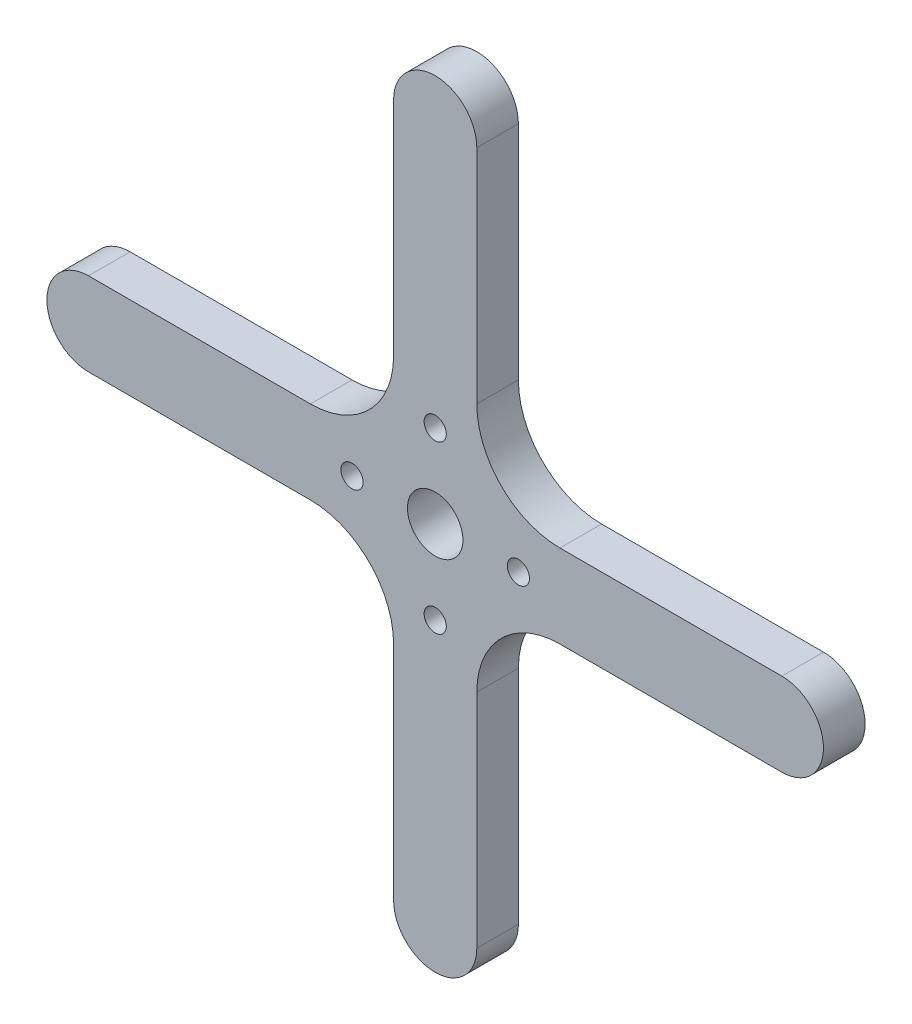
ISO-10303-21;
HEADER;
FILE_DESCRIPTION(('STEP AP214'),'2;1');
FILE_NAME('part.step','',(''),(''),'','','');
FILE_SCHEMA(('AUTOMOTIVE_DESIGN { 1 0 10303 214 1 1 1 1 }'));
ENDSEC;
DATA;
#1=APPLICATION_CONTEXT('core data for automotive mechanical design processes');
#2=APPLICATION_PROTOCOL_DEFINITION('international standard','automotive_design',2000,#1);
#3=PRODUCT_CONTEXT('',#1,'mechanical');
#4=PRODUCT('Part','Part','',(#3));
#5=PRODUCT_RELATED_PRODUCT_CATEGORY('part','',(#4));
#6=PRODUCT_DEFINITION_FORMATION('','',#4);
#7=PRODUCT_DEFINITION_CONTEXT('part definition',#1,'design');
#8=PRODUCT_DEFINITION('design','',#6,#7);
#9=PRODUCT_DEFINITION_SHAPE('','',#8);
#10=(LENGTH_UNIT() NAMED_UNIT(*) SI_UNIT(.MILLI.,.METRE.));
#11=(NAMED_UNIT(*) PLANE_ANGLE_UNIT() SI_UNIT($,.RADIAN.));
#12=(NAMED_UNIT(*) SI_UNIT($,.STERADIAN.) SOLID_ANGLE_UNIT());
#13=UNCERTAINTY_MEASURE_WITH_UNIT(LENGTH_MEASURE(1.E-05),#10,'distance_accuracy_value','');
#14=(GEOMETRIC_REPRESENTATION_CONTEXT(3) GLOBAL_UNCERTAINTY_ASSIGNED_CONTEXT((#13)) GLOBAL_UNIT_ASSIGNED_CONTEXT((#10,
#11,#12)) REPRESENTATION_CONTEXT('',''));
#15=CARTESIAN_POINT('',(0.,0.,0.));
#16=DIRECTION('',(0.,0.,1.));
#17=DIRECTION('',(1.,0.,0.));
#18=AXIS2_PLACEMENT_3D('',#15,#16,#17);
#19=CARTESIAN_POINT('',(0.,3.,3.));
#20=DIRECTION('',(0.,-1.,0.));
#21=DIRECTION('',(1.,0.,0.));
#22=AXIS2_PLACEMENT_3D('',#19,#20,#21);
#23=PLANE('',#22);
#24=DIRECTION('',(-1.,0.,0.));
#25=VECTOR('',#24,1.);
#26=CARTESIAN_POINT('',(0.,3.,0.));
#27=LINE('',#26,#25);
#28=CARTESIAN_POINT('',(25.,3.00000000000001,0.));
#29=VERTEX_POINT('',#28);
#30=CARTESIAN_POINT('',(8.99999999999999,3.00000000000001,0.));
#31=VERTEX_POINT('',#30);
#32=EDGE_CURVE('E241',#29,#31,#27,.T.);
#33=ORIENTED_EDGE('',*,*,#32,.T.);
#34=DIRECTION('',(0.,0.,-1.));
#35=VECTOR('',#34,1.);
#36=CARTESIAN_POINT('',(8.99999999999999,3.00000000000001,3.));
#37=LINE('',#36,#35);
#38=CARTESIAN_POINT('',(8.99999999999999,3.00000000000001,3.));
#39=VERTEX_POINT('',#38);
#40=EDGE_CURVE('E63',#31,#39,#37,.F.);
#41=ORIENTED_EDGE('',*,*,#40,.T.);
#42=DIRECTION('',(-1.,0.,0.));
#43=VECTOR('',#42,1.);
#44=CARTESIAN_POINT('',(0.,3.,3.));
#45=LINE('',#44,#43);
#46=CARTESIAN_POINT('',(25.,3.00000000000001,3.));
#47=VERTEX_POINT('',#46);
#48=EDGE_CURVE('E174',#47,#39,#45,.T.);
#49=ORIENTED_EDGE('',*,*,#48,.F.);
#50=DIRECTION('',(0.,0.,-1.));
#51=VECTOR('',#50,1.);
#52=CARTESIAN_POINT('',(25.,3.00000000000001,3.));
#53=LINE('',#52,#51);
#54=EDGE_CURVE('E240',#47,#29,#53,.T.);
#55=ORIENTED_EDGE('',*,*,#54,.T.);
#56=EDGE_LOOP('',(#33,#41,#49,#55));
#57=FACE_BOUND('',#56,.T.);
#58=ADVANCED_FACE('F47',(#57),#23,.F.);
#59=CARTESIAN_POINT('',(2.99999999999999,0.,3.));
#60=DIRECTION('',(-1.,0.,0.));
#61=DIRECTION('',(0.,-1.,0.));
#62=AXIS2_PLACEMENT_3D('',#59,#60,#61);
#63=PLANE('',#62);
#64=DIRECTION('',(0.,1.,0.));
#65=VECTOR('',#64,1.);
#66=CARTESIAN_POINT('',(2.99999999999999,0.,3.));
#67=LINE('',#66,#65);
#68=CARTESIAN_POINT('',(2.99999999999999,9.00000000000001,3.));
#69=VERTEX_POINT('',#68);
#70=CARTESIAN_POINT('',(2.99999999999999,25.,3.));
#71=VERTEX_POINT('',#70);
#72=EDGE_CURVE('E161',#69,#71,#67,.T.);
#73=ORIENTED_EDGE('',*,*,#72,.F.);
#74=DIRECTION('',(0.,0.,-1.));
#75=VECTOR('',#74,1.);
#76=CARTESIAN_POINT('',(2.99999999999999,9.00000000000001,0.));
#77=LINE('',#76,#75);
#78=CARTESIAN_POINT('',(2.99999999999999,9.00000000000001,0.));
#79=VERTEX_POINT('',#78);
#80=EDGE_CURVE('E340',#69,#79,#77,.T.);
#81=ORIENTED_EDGE('',*,*,#80,.T.);
#82=DIRECTION('',(0.,1.,0.));
#83=VECTOR('',#82,1.);
#84=CARTESIAN_POINT('',(2.99999999999999,0.,0.));
#85=LINE('',#84,#83);
#86=CARTESIAN_POINT('',(2.99999999999999,25.,0.));
#87=VERTEX_POINT('',#86);
#88=EDGE_CURVE('E179',#79,#87,#85,.T.);
#89=ORIENTED_EDGE('',*,*,#88,.T.);
#90=DIRECTION('',(0.,0.,-1.));
#91=VECTOR('',#90,1.);
#92=CARTESIAN_POINT('',(2.99999999999999,25.,3.));
#93=LINE('',#92,#91);
#94=EDGE_CURVE('E177',#71,#87,#93,.T.);
#95=ORIENTED_EDGE('',*,*,#94,.F.);
#96=EDGE_LOOP('',(#73,#81,#89,#95));
#97=FACE_BOUND('',#96,.T.);
#98=ADVANCED_FACE('F178',(#97),#63,.F.);
#99=CARTESIAN_POINT('',(0.,25.,3.));
#100=DIRECTION('',(0.,0.,-1.));
#101=DIRECTION('',(-1.,0.,0.));
#102=AXIS2_PLACEMENT_3D('',#99,#100,#101);
#103=CYLINDRICAL_SURFACE('',#102,3.);
#104=CARTESIAN_POINT('',(0.,25.,0.));
#105=DIRECTION('',(0.,0.,1.));
#106=DIRECTION('',(1.,0.,0.));
#107=AXIS2_PLACEMENT_3D('',#104,#105,#106);
#108=CIRCLE('',#107,3.);
#109=CARTESIAN_POINT('',(-3.00000000000001,25.,0.));
#110=VERTEX_POINT('',#109);
#111=EDGE_CURVE('E247',#87,#110,#108,.T.);
#112=ORIENTED_EDGE('',*,*,#111,.T.);
#113=DIRECTION('',(0.,0.,-1.));
#114=VECTOR('',#113,1.);
#115=CARTESIAN_POINT('',(-3.00000000000001,25.,3.));
#116=LINE('',#115,#114);
#117=CARTESIAN_POINT('',(-3.00000000000001,25.,3.));
#118=VERTEX_POINT('',#117);
#119=EDGE_CURVE('E185',#118,#110,#116,.T.);
#120=ORIENTED_EDGE('',*,*,#119,.F.);
#121=CARTESIAN_POINT('',(0.,25.,3.));
#122=DIRECTION('',(0.,0.,1.));
#123=DIRECTION('',(1.,0.,0.));
#124=AXIS2_PLACEMENT_3D('',#121,#122,#123);
#125=CIRCLE('',#124,3.);
#126=EDGE_CURVE('E167',#71,#118,#125,.T.);
#127=ORIENTED_EDGE('',*,*,#126,.F.);
#128=ORIENTED_EDGE('',*,*,#94,.T.);
#129=EDGE_LOOP('',(#112,#120,#127,#128));
#130=FACE_BOUND('',#129,.T.);
#131=ADVANCED_FACE('F187',(#130),#103,.T.);
#132=CARTESIAN_POINT('',(-3.00000000000001,0.,3.));
#133=DIRECTION('',(-1.,0.,0.));
#134=DIRECTION('',(0.,-1.,0.));
#135=AXIS2_PLACEMENT_3D('',#132,#133,#134);
#136=PLANE('',#135);
#137=DIRECTION('',(0.,1.,0.));
#138=VECTOR('',#137,1.);
#139=CARTESIAN_POINT('',(-3.00000000000001,0.,0.));
#140=LINE('',#139,#138);
#141=CARTESIAN_POINT('',(-3.00000000000001,9.,0.));
#142=VERTEX_POINT('',#141);
#143=EDGE_CURVE('E250',#142,#110,#140,.T.);
#144=ORIENTED_EDGE('',*,*,#143,.F.);
#145=DIRECTION('',(0.,0.,-1.));
#146=VECTOR('',#145,1.);
#147=CARTESIAN_POINT('',(-3.00000000000001,9.,3.));
#148=LINE('',#147,#146);
#149=CARTESIAN_POINT('',(-3.00000000000001,9.,3.));
#150=VERTEX_POINT('',#149);
#151=EDGE_CURVE('E323',#142,#150,#148,.F.);
#152=ORIENTED_EDGE('',*,*,#151,.T.);
#153=DIRECTION('',(0.,1.,0.));
#154=VECTOR('',#153,1.);
#155=CARTESIAN_POINT('',(-3.00000000000001,0.,3.));
#156=LINE('',#155,#154);
#157=EDGE_CURVE('E190',#150,#118,#156,.T.);
#158=ORIENTED_EDGE('',*,*,#157,.T.);
#159=ORIENTED_EDGE('',*,*,#119,.T.);
#160=EDGE_LOOP('',(#144,#152,#158,#159));
#161=FACE_BOUND('',#160,.T.);
#162=ADVANCED_FACE('F415',(#161),#136,.T.);
#163=CARTESIAN_POINT('',(0.,3.,3.));
#164=DIRECTION('',(0.,-1.,0.));
#165=DIRECTION('',(1.,0.,0.));
#166=AXIS2_PLACEMENT_3D('',#163,#164,#165);
#167=PLANE('',#166);
#168=DIRECTION('',(-1.,0.,0.));
#169=VECTOR('',#168,1.);
#170=CARTESIAN_POINT('',(0.,3.,3.));
#171=LINE('',#170,#169);
#172=CARTESIAN_POINT('',(-9.00000000000001,3.,3.));
#173=VERTEX_POINT('',#172);
#174=CARTESIAN_POINT('',(-25.,3.,3.));
#175=VERTEX_POINT('',#174);
#176=EDGE_CURVE('E193',#173,#175,#171,.T.);
#177=ORIENTED_EDGE('',*,*,#176,.F.);
#178=DIRECTION('',(0.,0.,-1.));
#179=VECTOR('',#178,1.);
#180=CARTESIAN_POINT('',(-9.00000000000001,3.,3.));
#181=LINE('',#180,#179);
#182=CARTESIAN_POINT('',(-9.00000000000001,3.,0.));
#183=VERTEX_POINT('',#182);
#184=EDGE_CURVE('E184',#173,#183,#181,.T.);
#185=ORIENTED_EDGE('',*,*,#184,.T.);
#186=DIRECTION('',(-1.,0.,0.));
#187=VECTOR('',#186,1.);
#188=CARTESIAN_POINT('',(0.,3.,0.));
#189=LINE('',#188,#187);
#190=CARTESIAN_POINT('',(-25.,3.,0.));
#191=VERTEX_POINT('',#190);
#192=EDGE_CURVE('E253',#183,#191,#189,.T.);
#193=ORIENTED_EDGE('',*,*,#192,.T.);
#194=DIRECTION('',(0.,0.,-1.));
#195=VECTOR('',#194,1.);
#196=CARTESIAN_POINT('',(-25.,3.,3.));
#197=LINE('',#196,#195);
#198=EDGE_CURVE('E314',#175,#191,#197,.T.);
#199=ORIENTED_EDGE('',*,*,#198,.F.);
#200=EDGE_LOOP('',(#177,#185,#193,#199));
#201=FACE_BOUND('',#200,.T.);
#202=ADVANCED_FACE('F408',(#201),#167,.F.);
#203=CARTESIAN_POINT('',(-25.,0.,3.));
#204=DIRECTION('',(0.,0.,-1.));
#205=DIRECTION('',(-1.,0.,0.));
#206=AXIS2_PLACEMENT_3D('',#203,#204,#205);
#207=CYLINDRICAL_SURFACE('',#206,3.);
#208=CARTESIAN_POINT('',(-25.,0.,0.));
#209=DIRECTION('',(0.,0.,1.));
#210=DIRECTION('',(1.,0.,0.));
#211=AXIS2_PLACEMENT_3D('',#208,#209,#210);
#212=CIRCLE('',#211,3.);
#213=CARTESIAN_POINT('',(-25.,-3.,0.));
#214=VERTEX_POINT('',#213);
#215=EDGE_CURVE('E256',#191,#214,#212,.T.);
#216=ORIENTED_EDGE('',*,*,#215,.T.);
#217=DIRECTION('',(0.,0.,-1.));
#218=VECTOR('',#217,1.);
#219=CARTESIAN_POINT('',(-25.,-3.,3.));
#220=LINE('',#219,#218);
#221=CARTESIAN_POINT('',(-25.,-3.,3.));
#222=VERTEX_POINT('',#221);
#223=EDGE_CURVE('E310',#222,#214,#220,.T.);
#224=ORIENTED_EDGE('',*,*,#223,.F.);
#225=CARTESIAN_POINT('',(-25.,0.,3.));
#226=DIRECTION('',(0.,0.,1.));
#227=DIRECTION('',(1.,0.,0.));
#228=AXIS2_PLACEMENT_3D('',#225,#226,#227);
#229=CIRCLE('',#228,3.);
#230=EDGE_CURVE('E199',#175,#222,#229,.T.);
#231=ORIENTED_EDGE('',*,*,#230,.F.);
#232=ORIENTED_EDGE('',*,*,#198,.T.);
#233=EDGE_LOOP('',(#216,#224,#231,#232));
#234=FACE_BOUND('',#233,.T.);
#235=ADVANCED_FACE('F402',(#234),#207,.T.);
#236=CARTESIAN_POINT('',(0.,-3.,3.));
#237=DIRECTION('',(0.,-1.,0.));
#238=DIRECTION('',(1.,0.,0.));
#239=AXIS2_PLACEMENT_3D('',#236,#237,#238);
#240=PLANE('',#239);
#241=DIRECTION('',(-1.,0.,0.));
#242=VECTOR('',#241,1.);
#243=CARTESIAN_POINT('',(0.,-3.,0.));
#244=LINE('',#243,#242);
#245=CARTESIAN_POINT('',(-9.00000000000001,-3.,0.));
#246=VERTEX_POINT('',#245);
#247=EDGE_CURVE('E260',#246,#214,#244,.T.);
#248=ORIENTED_EDGE('',*,*,#247,.F.);
#249=DIRECTION('',(0.,0.,-1.));
#250=VECTOR('',#249,1.);
#251=CARTESIAN_POINT('',(-9.00000000000001,-3.,3.));
#252=LINE('',#251,#250);
#253=CARTESIAN_POINT('',(-9.00000000000001,-3.,3.));
#254=VERTEX_POINT('',#253);
#255=EDGE_CURVE('E330',#246,#254,#252,.F.);
#256=ORIENTED_EDGE('',*,*,#255,.T.);
#257=DIRECTION('',(-1.,0.,0.));
#258=VECTOR('',#257,1.);
#259=CARTESIAN_POINT('',(0.,-3.,3.));
#260=LINE('',#259,#258);
#261=EDGE_CURVE('E203',#254,#222,#260,.T.);
#262=ORIENTED_EDGE('',*,*,#261,.T.);
#263=ORIENTED_EDGE('',*,*,#223,.T.);
#264=EDGE_LOOP('',(#248,#256,#262,#263));
#265=FACE_BOUND('',#264,.T.);
#266=ADVANCED_FACE('F397',(#265),#240,.T.);
#267=CARTESIAN_POINT('',(-3.00000000000001,0.,3.));
#268=DIRECTION('',(-1.,0.,0.));
#269=DIRECTION('',(0.,-1.,0.));
#270=AXIS2_PLACEMENT_3D('',#267,#268,#269);
#271=PLANE('',#270);
#272=DIRECTION('',(0.,1.,0.));
#273=VECTOR('',#272,1.);
#274=CARTESIAN_POINT('',(-3.00000000000001,0.,3.));
#275=LINE('',#274,#273);
#276=CARTESIAN_POINT('',(-3.00000000000001,-25.,3.));
#277=VERTEX_POINT('',#276);
#278=CARTESIAN_POINT('',(-3.00000000000001,-9.,3.));
#279=VERTEX_POINT('',#278);
#280=EDGE_CURVE('E206',#277,#279,#275,.T.);
#281=ORIENTED_EDGE('',*,*,#280,.T.);
#282=DIRECTION('',(0.,0.,-1.));
#283=VECTOR('',#282,1.);
#284=CARTESIAN_POINT('',(-3.00000000000001,-9.,0.));
#285=LINE('',#284,#283);
#286=CARTESIAN_POINT('',(-3.00000000000001,-9.,0.));
#287=VERTEX_POINT('',#286);
#288=EDGE_CURVE('E326',#279,#287,#285,.T.);
#289=ORIENTED_EDGE('',*,*,#288,.T.);
#290=DIRECTION('',(0.,1.,0.));
#291=VECTOR('',#290,1.);
#292=CARTESIAN_POINT('',(-3.00000000000001,0.,0.));
#293=LINE('',#292,#291);
#294=CARTESIAN_POINT('',(-3.00000000000001,-25.,0.));
#295=VERTEX_POINT('',#294);
#296=EDGE_CURVE('E263',#295,#287,#293,.T.);
#297=ORIENTED_EDGE('',*,*,#296,.F.);
#298=DIRECTION('',(0.,0.,-1.));
#299=VECTOR('',#298,1.);
#300=CARTESIAN_POINT('',(-3.00000000000001,-25.,3.));
#301=LINE('',#300,#299);
#302=EDGE_CURVE('E307',#277,#295,#301,.T.);
#303=ORIENTED_EDGE('',*,*,#302,.F.);
#304=EDGE_LOOP('',(#281,#289,#297,#303));
#305=FACE_BOUND('',#304,.T.);
#306=ADVANCED_FACE('F388',(#305),#271,.T.);
#307=CARTESIAN_POINT('',(0.,-25.,3.));
#308=DIRECTION('',(0.,0.,-1.));
#309=DIRECTION('',(-1.,0.,0.));
#310=AXIS2_PLACEMENT_3D('',#307,#308,#309);
#311=CYLINDRICAL_SURFACE('',#310,3.);
#312=CARTESIAN_POINT('',(0.,-25.,0.));
#313=DIRECTION('',(0.,0.,1.));
#314=DIRECTION('',(1.,0.,0.));
#315=AXIS2_PLACEMENT_3D('',#312,#313,#314);
#316=CIRCLE('',#315,3.);
#317=CARTESIAN_POINT('',(2.99999999999999,-25.,0.));
#318=VERTEX_POINT('',#317);
#319=EDGE_CURVE('E267',#295,#318,#316,.T.);
#320=ORIENTED_EDGE('',*,*,#319,.T.);
#321=DIRECTION('',(0.,0.,-1.));
#322=VECTOR('',#321,1.);
#323=CARTESIAN_POINT('',(2.99999999999999,-25.,3.));
#324=LINE('',#323,#322);
#325=CARTESIAN_POINT('',(2.99999999999999,-25.,3.));
#326=VERTEX_POINT('',#325);
#327=EDGE_CURVE('E303',#326,#318,#324,.T.);
#328=ORIENTED_EDGE('',*,*,#327,.F.);
#329=CARTESIAN_POINT('',(0.,-25.,3.));
#330=DIRECTION('',(0.,0.,1.));
#331=DIRECTION('',(1.,0.,0.));
#332=AXIS2_PLACEMENT_3D('',#329,#330,#331);
#333=CIRCLE('',#332,3.);
#334=EDGE_CURVE('E210',#277,#326,#333,.T.);
#335=ORIENTED_EDGE('',*,*,#334,.F.);
#336=ORIENTED_EDGE('',*,*,#302,.T.);
#337=EDGE_LOOP('',(#320,#328,#335,#336));
#338=FACE_BOUND('',#337,.T.);
#339=ADVANCED_FACE('F384',(#338),#311,.T.);
#340=CARTESIAN_POINT('',(2.99999999999999,0.,3.));
#341=DIRECTION('',(-1.,0.,0.));
#342=DIRECTION('',(0.,-1.,0.));
#343=AXIS2_PLACEMENT_3D('',#340,#341,#342);
#344=PLANE('',#343);
#345=DIRECTION('',(0.,1.,0.));
#346=VECTOR('',#345,1.);
#347=CARTESIAN_POINT('',(2.99999999999999,0.,0.));
#348=LINE('',#347,#346);
#349=CARTESIAN_POINT('',(2.99999999999999,-8.99999999999999,0.));
#350=VERTEX_POINT('',#349);
#351=EDGE_CURVE('E270',#318,#350,#348,.T.);
#352=ORIENTED_EDGE('',*,*,#351,.T.);
#353=DIRECTION('',(0.,0.,-1.));
#354=VECTOR('',#353,1.);
#355=CARTESIAN_POINT('',(2.99999999999999,-8.99999999999999,3.));
#356=LINE('',#355,#354);
#357=CARTESIAN_POINT('',(2.99999999999999,-8.99999999999999,3.));
#358=VERTEX_POINT('',#357);
#359=EDGE_CURVE('E337',#350,#358,#356,.F.);
#360=ORIENTED_EDGE('',*,*,#359,.T.);
#361=DIRECTION('',(0.,1.,0.));
#362=VECTOR('',#361,1.);
#363=CARTESIAN_POINT('',(2.99999999999999,0.,3.));
#364=LINE('',#363,#362);
#365=EDGE_CURVE('E213',#326,#358,#364,.T.);
#366=ORIENTED_EDGE('',*,*,#365,.F.);
#367=ORIENTED_EDGE('',*,*,#327,.T.);
#368=EDGE_LOOP('',(#352,#360,#366,#367));
#369=FACE_BOUND('',#368,.T.);
#370=ADVANCED_FACE('F380',(#369),#344,.F.);
#371=CARTESIAN_POINT('',(0.,-3.,3.));
#372=DIRECTION('',(0.,-1.,0.));
#373=DIRECTION('',(1.,0.,0.));
#374=AXIS2_PLACEMENT_3D('',#371,#372,#373);
#375=PLANE('',#374);
#376=DIRECTION('',(-1.,0.,0.));
#377=VECTOR('',#376,1.);
#378=CARTESIAN_POINT('',(0.,-3.,3.));
#379=LINE('',#378,#377);
#380=CARTESIAN_POINT('',(25.,-2.99999999999999,3.));
#381=VERTEX_POINT('',#380);
#382=CARTESIAN_POINT('',(8.99999999999999,-2.99999999999999,3.));
#383=VERTEX_POINT('',#382);
#384=EDGE_CURVE('E217',#381,#383,#379,.T.);
#385=ORIENTED_EDGE('',*,*,#384,.T.);
#386=DIRECTION('',(0.,0.,-1.));
#387=VECTOR('',#386,1.);
#388=CARTESIAN_POINT('',(8.99999999999999,-2.99999999999999,3.));
#389=LINE('',#388,#387);
#390=CARTESIAN_POINT('',(8.99999999999999,-2.99999999999999,0.));
#391=VERTEX_POINT('',#390);
#392=EDGE_CURVE('E333',#383,#391,#389,.T.);
#393=ORIENTED_EDGE('',*,*,#392,.T.);
#394=DIRECTION('',(-1.,0.,0.));
#395=VECTOR('',#394,1.);
#396=CARTESIAN_POINT('',(0.,-3.,0.));
#397=LINE('',#396,#395);
#398=CARTESIAN_POINT('',(25.,-2.99999999999999,0.));
#399=VERTEX_POINT('',#398);
#400=EDGE_CURVE('E274',#399,#391,#397,.T.);
#401=ORIENTED_EDGE('',*,*,#400,.F.);
#402=DIRECTION('',(0.,0.,-1.));
#403=VECTOR('',#402,1.);
#404=CARTESIAN_POINT('',(25.,-2.99999999999999,3.));
#405=LINE('',#404,#403);
#406=EDGE_CURVE('E300',#381,#399,#405,.T.);
#407=ORIENTED_EDGE('',*,*,#406,.F.);
#408=EDGE_LOOP('',(#385,#393,#401,#407));
#409=FACE_BOUND('',#408,.T.);
#410=ADVANCED_FACE('F370',(#409),#375,.T.);
#411=CARTESIAN_POINT('',(0.,6.,3.));
#412=DIRECTION('',(0.,0.,-1.));
#413=DIRECTION('',(-1.,0.,0.));
#414=AXIS2_PLACEMENT_3D('',#411,#412,#413);
#415=CYLINDRICAL_SURFACE('',#414,0.8);
#416=CARTESIAN_POINT('',(0.,6.,3.));
#417=DIRECTION('',(0.,0.,1.));
#418=DIRECTION('',(1.,0.,0.));
#419=AXIS2_PLACEMENT_3D('',#416,#417,#418);
#420=CIRCLE('',#419,0.8);
#421=CARTESIAN_POINT('',(0.799999999999999,6.,3.));
#422=VERTEX_POINT('',#421);
#423=EDGE_CURVE('E232',#422,#422,#420,.T.);
#424=ORIENTED_EDGE('',*,*,#423,.T.);
#425=EDGE_LOOP('',(#424));
#426=FACE_BOUND('',#425,.T.);
#427=CARTESIAN_POINT('',(0.,6.,0.));
#428=DIRECTION('',(0.,0.,1.));
#429=DIRECTION('',(1.,0.,0.));
#430=AXIS2_PLACEMENT_3D('',#427,#428,#429);
#431=CIRCLE('',#430,0.8);
#432=CARTESIAN_POINT('',(0.799999999999999,6.,0.));
#433=VERTEX_POINT('',#432);
#434=EDGE_CURVE('E289',#433,#433,#431,.T.);
#435=ORIENTED_EDGE('',*,*,#434,.F.);
#436=EDGE_LOOP('',(#435));
#437=FACE_BOUND('',#436,.T.);
#438=ADVANCED_FACE('F461',(#426,#437),#415,.F.);
#439=CARTESIAN_POINT('',(0.,-6.,3.));
#440=DIRECTION('',(0.,0.,-1.));
#441=DIRECTION('',(-1.,0.,0.));
#442=AXIS2_PLACEMENT_3D('',#439,#440,#441);
#443=CYLINDRICAL_SURFACE('',#442,0.8);
#444=CARTESIAN_POINT('',(0.,-6.,3.));
#445=DIRECTION('',(0.,0.,1.));
#446=DIRECTION('',(1.,0.,0.));
#447=AXIS2_PLACEMENT_3D('',#444,#445,#446);
#448=CIRCLE('',#447,0.8);
#449=CARTESIAN_POINT('',(0.800000000000002,-6.,3.));
#450=VERTEX_POINT('',#449);
#451=EDGE_CURVE('E228',#450,#450,#448,.T.);
#452=ORIENTED_EDGE('',*,*,#451,.T.);
#453=EDGE_LOOP('',(#452));
#454=FACE_BOUND('',#453,.T.);
#455=CARTESIAN_POINT('',(0.,-6.,0.));
#456=DIRECTION('',(0.,0.,1.));
#457=DIRECTION('',(1.,0.,0.));
#458=AXIS2_PLACEMENT_3D('',#455,#456,#457);
#459=CIRCLE('',#458,0.8);
#460=CARTESIAN_POINT('',(0.800000000000002,-6.,0.));
#461=VERTEX_POINT('',#460);
#462=EDGE_CURVE('E285',#461,#461,#459,.T.);
#463=ORIENTED_EDGE('',*,*,#462,.F.);
#464=EDGE_LOOP('',(#463));
#465=FACE_BOUND('',#464,.T.);
#466=ADVANCED_FACE('F464',(#454,#465),#443,.F.);
#467=CARTESIAN_POINT('',(-6.,0.,3.));
#468=DIRECTION('',(0.,0.,-1.));
#469=DIRECTION('',(-1.,0.,0.));
#470=AXIS2_PLACEMENT_3D('',#467,#468,#469);
#471=CYLINDRICAL_SURFACE('',#470,0.800000000000001);
#472=CARTESIAN_POINT('',(-6.,0.,3.));
#473=DIRECTION('',(0.,0.,1.));
#474=DIRECTION('',(1.,0.,0.));
#475=AXIS2_PLACEMENT_3D('',#472,#473,#474);
#476=CIRCLE('',#475,0.800000000000001);
#477=CARTESIAN_POINT('',(-5.2,0.,3.));
#478=VERTEX_POINT('',#477);
#479=EDGE_CURVE('E224',#478,#478,#476,.T.);
#480=ORIENTED_EDGE('',*,*,#479,.T.);
#481=EDGE_LOOP('',(#480));
#482=FACE_BOUND('',#481,.T.);
#483=CARTESIAN_POINT('',(-6.,0.,0.));
#484=DIRECTION('',(0.,0.,1.));
#485=DIRECTION('',(1.,0.,0.));
#486=AXIS2_PLACEMENT_3D('',#483,#484,#485);
#487=CIRCLE('',#486,0.800000000000001);
#488=CARTESIAN_POINT('',(-5.2,0.,0.));
#489=VERTEX_POINT('',#488);
#490=EDGE_CURVE('E281',#489,#489,#487,.T.);
#491=ORIENTED_EDGE('',*,*,#490,.F.);
#492=EDGE_LOOP('',(#491));
#493=FACE_BOUND('',#492,.T.);
#494=ADVANCED_FACE('F468',(#482,#493),#471,.F.);
#495=CARTESIAN_POINT('',(25.,0.,3.));
#496=DIRECTION('',(0.,0.,-1.));
#497=DIRECTION('',(-1.,0.,0.));
#498=AXIS2_PLACEMENT_3D('',#495,#496,#497);
#499=CYLINDRICAL_SURFACE('',#498,3.);
#500=CARTESIAN_POINT('',(25.,0.,0.));
#501=DIRECTION('',(0.,0.,1.));
#502=DIRECTION('',(1.,0.,0.));
#503=AXIS2_PLACEMENT_3D('',#500,#501,#502);
#504=CIRCLE('',#503,3.);
#505=EDGE_CURVE('E278',#399,#29,#504,.T.);
#506=ORIENTED_EDGE('',*,*,#505,.T.);
#507=ORIENTED_EDGE('',*,*,#54,.F.);
#508=CARTESIAN_POINT('',(25.,0.,3.));
#509=DIRECTION('',(0.,0.,1.));
#510=DIRECTION('',(1.,0.,0.));
#511=AXIS2_PLACEMENT_3D('',#508,#509,#510);
#512=CIRCLE('',#511,3.);
#513=EDGE_CURVE('E221',#381,#47,#512,.T.);
#514=ORIENTED_EDGE('',*,*,#513,.F.);
#515=ORIENTED_EDGE('',*,*,#406,.T.);
#516=EDGE_LOOP('',(#506,#507,#514,#515));
#517=FACE_BOUND('',#516,.T.);
#518=ADVANCED_FACE('F459',(#517),#499,.T.);
#519=CARTESIAN_POINT('',(6.,0.,3.));
#520=DIRECTION('',(0.,0.,-1.));
#521=DIRECTION('',(-1.,0.,0.));
#522=AXIS2_PLACEMENT_3D('',#519,#520,#521);
#523=CYLINDRICAL_SURFACE('',#522,0.800000000000001);
#524=CARTESIAN_POINT('',(6.,0.,3.));
#525=DIRECTION('',(0.,0.,1.));
#526=DIRECTION('',(1.,0.,0.));
#527=AXIS2_PLACEMENT_3D('',#524,#525,#526);
#528=CIRCLE('',#527,0.800000000000001);
#529=CARTESIAN_POINT('',(6.8,0.,3.));
#530=VERTEX_POINT('',#529);
#531=EDGE_CURVE('E236',#530,#530,#528,.T.);
#532=ORIENTED_EDGE('',*,*,#531,.T.);
#533=EDGE_LOOP('',(#532));
#534=FACE_BOUND('',#533,.T.);
#535=CARTESIAN_POINT('',(6.,0.,0.));
#536=DIRECTION('',(0.,0.,1.));
#537=DIRECTION('',(1.,0.,0.));
#538=AXIS2_PLACEMENT_3D('',#535,#536,#537);
#539=CIRCLE('',#538,0.800000000000001);
#540=CARTESIAN_POINT('',(6.8,0.,0.));
#541=VERTEX_POINT('',#540);
#542=EDGE_CURVE('E293',#541,#541,#539,.T.);
#543=ORIENTED_EDGE('',*,*,#542,.F.);
#544=EDGE_LOOP('',(#543));
#545=FACE_BOUND('',#544,.T.);
#546=ADVANCED_FACE('F454',(#534,#545),#523,.F.);
#547=CARTESIAN_POINT('',(0.,0.,3.));
#548=DIRECTION('',(0.,0.,1.));
#549=DIRECTION('',(1.,0.,0.));
#550=AXIS2_PLACEMENT_3D('',#547,#548,#549);
#551=PLANE('',#550);
#552=CARTESIAN_POINT('',(0.,0.,3.));
#553=DIRECTION('',(0.,0.,1.));
#554=DIRECTION('',(1.,0.,0.));
#555=AXIS2_PLACEMENT_3D('',#552,#553,#554);
#556=CIRCLE('',#555,2.);
#557=CARTESIAN_POINT('',(2.,0.,3.));
#558=VERTEX_POINT('',#557);
#559=EDGE_CURVE('E636',#558,#558,#556,.T.);
#560=ORIENTED_EDGE('',*,*,#559,.F.);
#561=EDGE_LOOP('',(#560));
#562=FACE_BOUND('',#561,.T.);
#563=ORIENTED_EDGE('',*,*,#48,.T.);
#564=CARTESIAN_POINT('',(8.99999999999999,9.00000000000001,3.));
#565=DIRECTION('',(0.,0.,1.));
#566=DIRECTION('',(1.,0.,0.));
#567=AXIS2_PLACEMENT_3D('',#564,#565,#566);
#568=CIRCLE('',#567,6.);
#569=EDGE_CURVE('E11',#39,#69,#568,.F.);
#570=ORIENTED_EDGE('',*,*,#569,.T.);
#571=ORIENTED_EDGE('',*,*,#72,.T.);
#572=ORIENTED_EDGE('',*,*,#126,.T.);
#573=ORIENTED_EDGE('',*,*,#157,.F.);
#574=CARTESIAN_POINT('',(-9.00000000000001,9.,3.));
#575=DIRECTION('',(0.,0.,1.));
#576=DIRECTION('',(1.,0.,0.));
#577=AXIS2_PLACEMENT_3D('',#574,#575,#576);
#578=CIRCLE('',#577,6.);
#579=EDGE_CURVE('E348',#150,#173,#578,.F.);
#580=ORIENTED_EDGE('',*,*,#579,.T.);
#581=ORIENTED_EDGE('',*,*,#176,.T.);
#582=ORIENTED_EDGE('',*,*,#230,.T.);
#583=ORIENTED_EDGE('',*,*,#261,.F.);
#584=CARTESIAN_POINT('',(-9.00000000000001,-9.,3.));
#585=DIRECTION('',(0.,0.,1.));
#586=DIRECTION('',(1.,0.,0.));
#587=AXIS2_PLACEMENT_3D('',#584,#585,#586);
#588=CIRCLE('',#587,6.);
#589=EDGE_CURVE('E354',#254,#279,#588,.F.);
#590=ORIENTED_EDGE('',*,*,#589,.T.);
#591=ORIENTED_EDGE('',*,*,#280,.F.);
#592=ORIENTED_EDGE('',*,*,#334,.T.);
#593=ORIENTED_EDGE('',*,*,#365,.T.);
#594=CARTESIAN_POINT('',(8.99999999999999,-8.99999999999999,3.));
#595=DIRECTION('',(0.,0.,1.));
#596=DIRECTION('',(1.,0.,0.));
#597=AXIS2_PLACEMENT_3D('',#594,#595,#596);
#598=CIRCLE('',#597,6.);
#599=EDGE_CURVE('E360',#358,#383,#598,.F.);
#600=ORIENTED_EDGE('',*,*,#599,.T.);
#601=ORIENTED_EDGE('',*,*,#384,.F.);
#602=ORIENTED_EDGE('',*,*,#513,.T.);
#603=EDGE_LOOP('',(#563,#570,#571,#572,#573,#580,#581,#582,#583,#590,#591,#592,#593,#600,#601,#602));
#604=FACE_BOUND('',#603,.T.);
#605=ORIENTED_EDGE('',*,*,#479,.F.);
#606=EDGE_LOOP('',(#605));
#607=FACE_BOUND('',#606,.T.);
#608=ORIENTED_EDGE('',*,*,#451,.F.);
#609=EDGE_LOOP('',(#608));
#610=FACE_BOUND('',#609,.T.);
#611=ORIENTED_EDGE('',*,*,#423,.F.);
#612=EDGE_LOOP('',(#611));
#613=FACE_BOUND('',#612,.T.);
#614=ORIENTED_EDGE('',*,*,#531,.F.);
#615=EDGE_LOOP('',(#614));
#616=FACE_BOUND('',#615,.T.);
#617=ADVANCED_FACE('F163',(#562,#604,#607,#610,#613,#616),#551,.T.);
#618=CARTESIAN_POINT('',(0.,0.,0.));
#619=DIRECTION('',(0.,0.,1.));
#620=DIRECTION('',(1.,0.,0.));
#621=AXIS2_PLACEMENT_3D('',#618,#619,#620);
#622=PLANE('',#621);
#623=CARTESIAN_POINT('',(0.,0.,0.));
#624=DIRECTION('',(0.,0.,1.));
#625=DIRECTION('',(1.,0.,0.));
#626=AXIS2_PLACEMENT_3D('',#623,#624,#625);
#627=CIRCLE('',#626,2.);
#628=CARTESIAN_POINT('',(2.,0.,0.));
#629=VERTEX_POINT('',#628);
#630=EDGE_CURVE('E244',#629,#629,#627,.T.);
#631=ORIENTED_EDGE('',*,*,#630,.T.);
#632=EDGE_LOOP('',(#631));
#633=FACE_BOUND('',#632,.T.);
#634=ORIENTED_EDGE('',*,*,#32,.F.);
#635=ORIENTED_EDGE('',*,*,#505,.F.);
#636=ORIENTED_EDGE('',*,*,#400,.T.);
#637=CARTESIAN_POINT('',(8.99999999999999,-8.99999999999999,0.));
#638=DIRECTION('',(0.,0.,1.));
#639=DIRECTION('',(1.,0.,0.));
#640=AXIS2_PLACEMENT_3D('',#637,#638,#639);
#641=CIRCLE('',#640,6.);
#642=EDGE_CURVE('E357',#391,#350,#641,.T.);
#643=ORIENTED_EDGE('',*,*,#642,.T.);
#644=ORIENTED_EDGE('',*,*,#351,.F.);
#645=ORIENTED_EDGE('',*,*,#319,.F.);
#646=ORIENTED_EDGE('',*,*,#296,.T.);
#647=CARTESIAN_POINT('',(-9.00000000000001,-9.,0.));
#648=DIRECTION('',(0.,0.,1.));
#649=DIRECTION('',(1.,0.,0.));
#650=AXIS2_PLACEMENT_3D('',#647,#648,#649);
#651=CIRCLE('',#650,6.);
#652=EDGE_CURVE('E351',#287,#246,#651,.T.);
#653=ORIENTED_EDGE('',*,*,#652,.T.);
#654=ORIENTED_EDGE('',*,*,#247,.T.);
#655=ORIENTED_EDGE('',*,*,#215,.F.);
#656=ORIENTED_EDGE('',*,*,#192,.F.);
#657=CARTESIAN_POINT('',(-9.00000000000001,9.,0.));
#658=DIRECTION('',(0.,0.,1.));
#659=DIRECTION('',(1.,0.,0.));
#660=AXIS2_PLACEMENT_3D('',#657,#658,#659);
#661=CIRCLE('',#660,6.);
#662=EDGE_CURVE('E345',#183,#142,#661,.T.);
#663=ORIENTED_EDGE('',*,*,#662,.T.);
#664=ORIENTED_EDGE('',*,*,#143,.T.);
#665=ORIENTED_EDGE('',*,*,#111,.F.);
#666=ORIENTED_EDGE('',*,*,#88,.F.);
#667=CARTESIAN_POINT('',(8.99999999999999,9.00000000000001,0.));
#668=DIRECTION('',(0.,0.,1.));
#669=DIRECTION('',(1.,0.,0.));
#670=AXIS2_PLACEMENT_3D('',#667,#668,#669);
#671=CIRCLE('',#670,6.);
#672=EDGE_CURVE('E56',#79,#31,#671,.T.);
#673=ORIENTED_EDGE('',*,*,#672,.T.);
#674=EDGE_LOOP('',(#634,#635,#636,#643,#644,#645,#646,#653,#654,#655,#656,#663,#664,#665,#666,#673));
#675=FACE_BOUND('',#674,.T.);
#676=ORIENTED_EDGE('',*,*,#490,.T.);
#677=EDGE_LOOP('',(#676));
#678=FACE_BOUND('',#677,.T.);
#679=ORIENTED_EDGE('',*,*,#462,.T.);
#680=EDGE_LOOP('',(#679));
#681=FACE_BOUND('',#680,.T.);
#682=ORIENTED_EDGE('',*,*,#434,.T.);
#683=EDGE_LOOP('',(#682));
#684=FACE_BOUND('',#683,.T.);
#685=ORIENTED_EDGE('',*,*,#542,.T.);
#686=EDGE_LOOP('',(#685));
#687=FACE_BOUND('',#686,.T.);
#688=ADVANCED_FACE('F375',(#633,#675,#678,#681,#684,#687),#622,.F.);
#689=CARTESIAN_POINT('',(-9.00000000000001,9.,3.));
#690=DIRECTION('',(0.,0.,-1.));
#691=DIRECTION('',(-1.,0.,0.));
#692=AXIS2_PLACEMENT_3D('',#689,#690,#691);
#693=CYLINDRICAL_SURFACE('',#692,6.);
#694=ORIENTED_EDGE('',*,*,#579,.F.);
#695=ORIENTED_EDGE('',*,*,#151,.F.);
#696=ORIENTED_EDGE('',*,*,#662,.F.);
#697=ORIENTED_EDGE('',*,*,#184,.F.);
#698=EDGE_LOOP('',(#694,#695,#696,#697));
#699=FACE_BOUND('',#698,.T.);
#700=ADVANCED_FACE('F412',(#699),#693,.F.);
#701=CARTESIAN_POINT('',(-9.00000000000001,-9.,3.));
#702=DIRECTION('',(0.,0.,1.));
#703=DIRECTION('',(1.,0.,0.));
#704=AXIS2_PLACEMENT_3D('',#701,#702,#703);
#705=CYLINDRICAL_SURFACE('',#704,6.);
#706=ORIENTED_EDGE('',*,*,#589,.F.);
#707=ORIENTED_EDGE('',*,*,#255,.F.);
#708=ORIENTED_EDGE('',*,*,#652,.F.);
#709=ORIENTED_EDGE('',*,*,#288,.F.);
#710=EDGE_LOOP('',(#706,#707,#708,#709));
#711=FACE_BOUND('',#710,.T.);
#712=ADVANCED_FACE('F392',(#711),#705,.F.);
#713=CARTESIAN_POINT('',(8.99999999999999,-8.99999999999999,3.));
#714=DIRECTION('',(0.,0.,-1.));
#715=DIRECTION('',(-1.,0.,0.));
#716=AXIS2_PLACEMENT_3D('',#713,#714,#715);
#717=CYLINDRICAL_SURFACE('',#716,6.);
#718=ORIENTED_EDGE('',*,*,#599,.F.);
#719=ORIENTED_EDGE('',*,*,#359,.F.);
#720=ORIENTED_EDGE('',*,*,#642,.F.);
#721=ORIENTED_EDGE('',*,*,#392,.F.);
#722=EDGE_LOOP('',(#718,#719,#720,#721));
#723=FACE_BOUND('',#722,.T.);
#724=ADVANCED_FACE('F373',(#723),#717,.F.);
#725=CARTESIAN_POINT('',(8.99999999999999,9.00000000000001,3.));
#726=DIRECTION('',(0.,0.,1.));
#727=DIRECTION('',(1.,0.,0.));
#728=AXIS2_PLACEMENT_3D('',#725,#726,#727);
#729=CYLINDRICAL_SURFACE('',#728,6.);
#730=ORIENTED_EDGE('',*,*,#569,.F.);
#731=ORIENTED_EDGE('',*,*,#40,.F.);
#732=ORIENTED_EDGE('',*,*,#672,.F.);
#733=ORIENTED_EDGE('',*,*,#80,.F.);
#734=EDGE_LOOP('',(#730,#731,#732,#733));
#735=FACE_BOUND('',#734,.T.);
#736=ADVANCED_FACE('F49',(#735),#729,.F.);
#737=CARTESIAN_POINT('',(0.,0.,0.));
#738=DIRECTION('',(0.,0.,1.));
#739=DIRECTION('',(1.,0.,0.));
#740=AXIS2_PLACEMENT_3D('',#737,#738,#739);
#741=CYLINDRICAL_SURFACE('',#740,2.);
#742=ORIENTED_EDGE('',*,*,#630,.F.);
#743=EDGE_LOOP('',(#742));
#744=FACE_BOUND('',#743,.T.);
#745=ORIENTED_EDGE('',*,*,#559,.T.);
#746=EDGE_LOOP('',(#745));
#747=FACE_BOUND('',#746,.T.);
#748=ADVANCED_FACE('F439',(#744,#747),#741,.F.);
#749=CLOSED_SHELL('',(#58,#98,#131,#162,#202,#235,#266,#306,#339,#370,#410,#438,#466,#494,#518,
#546,#617,#688,#700,#712,#724,#736,#748));
#750=MANIFOLD_SOLID_BREP('B2',#749);
#751=ADVANCED_BREP_SHAPE_REPRESENTATION('',(#18,#750),#14);
#752=SHAPE_DEFINITION_REPRESENTATION(#9,#751);
ENDSEC;
END-ISO-10303-21;
